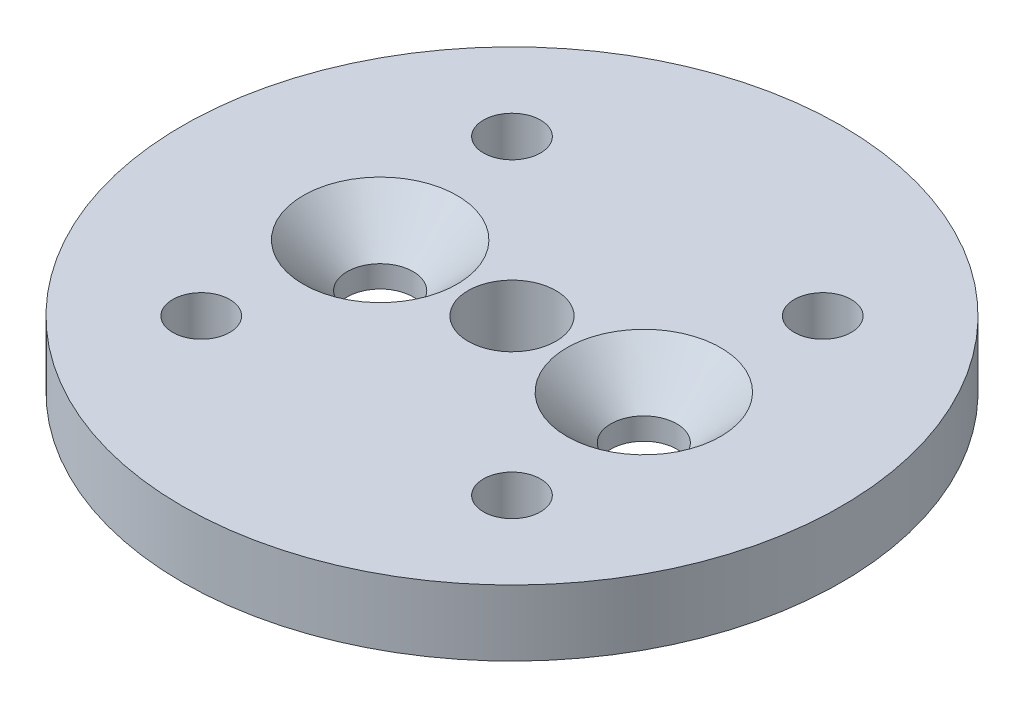
ISO-10303-21;
HEADER;
FILE_DESCRIPTION(('STEP AP214'),'2;1');
FILE_NAME('part.step','',(''),(''),'','','');
FILE_SCHEMA(('AUTOMOTIVE_DESIGN { 1 0 10303 214 1 1 1 1 }'));
ENDSEC;
DATA;
#1=APPLICATION_CONTEXT('core data for automotive mechanical design processes');
#2=APPLICATION_PROTOCOL_DEFINITION('international standard','automotive_design',2000,#1);
#3=PRODUCT_CONTEXT('',#1,'mechanical');
#4=PRODUCT('Part','Part','',(#3));
#5=PRODUCT_RELATED_PRODUCT_CATEGORY('part','',(#4));
#6=PRODUCT_DEFINITION_FORMATION('','',#4);
#7=PRODUCT_DEFINITION_CONTEXT('part definition',#1,'design');
#8=PRODUCT_DEFINITION('design','',#6,#7);
#9=PRODUCT_DEFINITION_SHAPE('','',#8);
#10=(LENGTH_UNIT() NAMED_UNIT(*) SI_UNIT(.MILLI.,.METRE.));
#11=(NAMED_UNIT(*) PLANE_ANGLE_UNIT() SI_UNIT($,.RADIAN.));
#12=(NAMED_UNIT(*) SI_UNIT($,.STERADIAN.) SOLID_ANGLE_UNIT());
#13=UNCERTAINTY_MEASURE_WITH_UNIT(LENGTH_MEASURE(1.E-05),#10,'distance_accuracy_value','');
#14=(GEOMETRIC_REPRESENTATION_CONTEXT(3) GLOBAL_UNCERTAINTY_ASSIGNED_CONTEXT((#13)) GLOBAL_UNIT_ASSIGNED_CONTEXT((#10,
#11,#12)) REPRESENTATION_CONTEXT('',''));
#15=CARTESIAN_POINT('',(0.,0.,0.));
#16=DIRECTION('',(0.,0.,1.));
#17=DIRECTION('',(1.,0.,0.));
#18=AXIS2_PLACEMENT_3D('',#15,#16,#17);
#19=CARTESIAN_POINT('',(0.,3.,0.));
#20=DIRECTION('',(0.,1.,0.));
#21=DIRECTION('',(0.,0.,1.));
#22=AXIS2_PLACEMENT_3D('',#19,#20,#21);
#23=PLANE('',#22);
#24=CARTESIAN_POINT('',(7.07213578500707,3.,-7.07213578500707));
#25=DIRECTION('',(0.,1.,0.));
#26=DIRECTION('',(0.,0.,1.));
#27=AXIS2_PLACEMENT_3D('',#24,#25,#26);
#28=CIRCLE('',#27,1.3);
#29=CARTESIAN_POINT('',(7.07213578500707,3.,-5.77213578500707));
#30=VERTEX_POINT('',#29);
#31=EDGE_CURVE('E88',#30,#30,#28,.T.);
#32=ORIENTED_EDGE('',*,*,#31,.F.);
#33=EDGE_LOOP('',(#32));
#34=FACE_BOUND('',#33,.T.);
#35=CARTESIAN_POINT('',(7.07213578500707,3.,7.07213578500707));
#36=DIRECTION('',(0.,1.,0.));
#37=DIRECTION('',(0.,0.,1.));
#38=AXIS2_PLACEMENT_3D('',#35,#36,#37);
#39=CIRCLE('',#38,1.3);
#40=CARTESIAN_POINT('',(7.07213578500707,3.,8.37213578500707));
#41=VERTEX_POINT('',#40);
#42=EDGE_CURVE('E82',#41,#41,#39,.T.);
#43=ORIENTED_EDGE('',*,*,#42,.F.);
#44=EDGE_LOOP('',(#43));
#45=FACE_BOUND('',#44,.T.);
#46=CARTESIAN_POINT('',(-7.07213578500707,3.,7.07213578500707));
#47=DIRECTION('',(0.,1.,0.));
#48=DIRECTION('',(0.,0.,1.));
#49=AXIS2_PLACEMENT_3D('',#46,#47,#48);
#50=CIRCLE('',#49,1.3);
#51=CARTESIAN_POINT('',(-7.07213578500707,3.,8.37213578500707));
#52=VERTEX_POINT('',#51);
#53=EDGE_CURVE('E76',#52,#52,#50,.T.);
#54=ORIENTED_EDGE('',*,*,#53,.F.);
#55=EDGE_LOOP('',(#54));
#56=FACE_BOUND('',#55,.T.);
#57=CARTESIAN_POINT('',(-7.07213578500707,3.,-7.07213578500707));
#58=DIRECTION('',(0.,1.,0.));
#59=DIRECTION('',(0.,0.,1.));
#60=AXIS2_PLACEMENT_3D('',#57,#58,#59);
#61=CIRCLE('',#60,1.3);
#62=CARTESIAN_POINT('',(-7.07213578500707,3.,-5.77213578500707));
#63=VERTEX_POINT('',#62);
#64=EDGE_CURVE('E70',#63,#63,#61,.T.);
#65=ORIENTED_EDGE('',*,*,#64,.F.);
#66=EDGE_LOOP('',(#65));
#67=FACE_BOUND('',#66,.T.);
#68=CARTESIAN_POINT('',(6.,3.,0.));
#69=DIRECTION('',(0.,1.,0.));
#70=DIRECTION('',(0.,0.,1.));
#71=AXIS2_PLACEMENT_3D('',#68,#69,#70);
#72=CIRCLE('',#71,3.50000000000001);
#73=CARTESIAN_POINT('',(6.,3.,3.50000000000001));
#74=VERTEX_POINT('',#73);
#75=EDGE_CURVE('E38',#74,#74,#72,.F.);
#76=ORIENTED_EDGE('',*,*,#75,.T.);
#77=EDGE_LOOP('',(#76));
#78=FACE_BOUND('',#77,.T.);
#79=CARTESIAN_POINT('',(-6.,3.,0.));
#80=DIRECTION('',(0.,1.,0.));
#81=DIRECTION('',(0.,0.,1.));
#82=AXIS2_PLACEMENT_3D('',#79,#80,#81);
#83=CIRCLE('',#82,3.50000000000001);
#84=CARTESIAN_POINT('',(-6.,3.,3.50000000000001));
#85=VERTEX_POINT('',#84);
#86=EDGE_CURVE('E42',#85,#85,#83,.F.);
#87=ORIENTED_EDGE('',*,*,#86,.T.);
#88=EDGE_LOOP('',(#87));
#89=FACE_BOUND('',#88,.T.);
#90=CARTESIAN_POINT('',(0.,3.,0.));
#91=DIRECTION('',(0.,1.,0.));
#92=DIRECTION('',(0.,0.,1.));
#93=AXIS2_PLACEMENT_3D('',#90,#91,#92);
#94=CIRCLE('',#93,15.);
#95=CARTESIAN_POINT('',(0.,3.,15.));
#96=VERTEX_POINT('',#95);
#97=EDGE_CURVE('E51',#96,#96,#94,.T.);
#98=ORIENTED_EDGE('',*,*,#97,.T.);
#99=EDGE_LOOP('',(#98));
#100=FACE_BOUND('',#99,.T.);
#101=CARTESIAN_POINT('',(0.,3.,0.));
#102=DIRECTION('',(0.,1.,0.));
#103=DIRECTION('',(0.,0.,1.));
#104=AXIS2_PLACEMENT_3D('',#101,#102,#103);
#105=CIRCLE('',#104,2.);
#106=CARTESIAN_POINT('',(0.,3.,2.));
#107=VERTEX_POINT('',#106);
#108=EDGE_CURVE('E55',#107,#107,#105,.T.);
#109=ORIENTED_EDGE('',*,*,#108,.F.);
#110=EDGE_LOOP('',(#109));
#111=FACE_BOUND('',#110,.T.);
#112=ADVANCED_FACE('F31',(#34,#45,#56,#67,#78,#89,#100,#111),#23,.T.);
#113=CARTESIAN_POINT('',(0.,0.,0.));
#114=DIRECTION('',(0.,1.,0.));
#115=DIRECTION('',(0.,0.,1.));
#116=AXIS2_PLACEMENT_3D('',#113,#114,#115);
#117=PLANE('',#116);
#118=CARTESIAN_POINT('',(7.07213578500707,0.,-7.07213578500707));
#119=DIRECTION('',(0.,1.,0.));
#120=DIRECTION('',(0.,0.,1.));
#121=AXIS2_PLACEMENT_3D('',#118,#119,#120);
#122=CIRCLE('',#121,1.3);
#123=CARTESIAN_POINT('',(7.07213578500707,0.,-5.77213578500707));
#124=VERTEX_POINT('',#123);
#125=EDGE_CURVE('E73',#124,#124,#122,.T.);
#126=ORIENTED_EDGE('',*,*,#125,.T.);
#127=EDGE_LOOP('',(#126));
#128=FACE_BOUND('',#127,.T.);
#129=CARTESIAN_POINT('',(7.07213578500707,0.,7.07213578500707));
#130=DIRECTION('',(0.,1.,0.));
#131=DIRECTION('',(0.,0.,1.));
#132=AXIS2_PLACEMENT_3D('',#129,#130,#131);
#133=CIRCLE('',#132,1.3);
#134=CARTESIAN_POINT('',(7.07213578500707,0.,8.37213578500707));
#135=VERTEX_POINT('',#134);
#136=EDGE_CURVE('E85',#135,#135,#133,.T.);
#137=ORIENTED_EDGE('',*,*,#136,.T.);
#138=EDGE_LOOP('',(#137));
#139=FACE_BOUND('',#138,.T.);
#140=CARTESIAN_POINT('',(-7.07213578500707,0.,7.07213578500707));
#141=DIRECTION('',(0.,1.,0.));
#142=DIRECTION('',(0.,0.,1.));
#143=AXIS2_PLACEMENT_3D('',#140,#141,#142);
#144=CIRCLE('',#143,1.3);
#145=CARTESIAN_POINT('',(-7.07213578500707,0.,8.37213578500707));
#146=VERTEX_POINT('',#145);
#147=EDGE_CURVE('E79',#146,#146,#144,.T.);
#148=ORIENTED_EDGE('',*,*,#147,.T.);
#149=EDGE_LOOP('',(#148));
#150=FACE_BOUND('',#149,.T.);
#151=CARTESIAN_POINT('',(-7.07213578500707,0.,-7.07213578500707));
#152=DIRECTION('',(0.,1.,0.));
#153=DIRECTION('',(0.,0.,1.));
#154=AXIS2_PLACEMENT_3D('',#151,#152,#153);
#155=CIRCLE('',#154,1.3);
#156=CARTESIAN_POINT('',(-7.07213578500707,0.,-5.77213578500707));
#157=VERTEX_POINT('',#156);
#158=EDGE_CURVE('E69',#157,#157,#155,.T.);
#159=ORIENTED_EDGE('',*,*,#158,.T.);
#160=EDGE_LOOP('',(#159));
#161=FACE_BOUND('',#160,.T.);
#162=CARTESIAN_POINT('',(-6.,0.,0.));
#163=DIRECTION('',(0.,1.,0.));
#164=DIRECTION('',(0.,0.,1.));
#165=AXIS2_PLACEMENT_3D('',#162,#163,#164);
#166=CIRCLE('',#165,1.5);
#167=CARTESIAN_POINT('',(-6.,0.,1.5));
#168=VERTEX_POINT('',#167);
#169=EDGE_CURVE('E66',#168,#168,#166,.T.);
#170=ORIENTED_EDGE('',*,*,#169,.T.);
#171=EDGE_LOOP('',(#170));
#172=FACE_BOUND('',#171,.T.);
#173=CARTESIAN_POINT('',(6.,0.,0.));
#174=DIRECTION('',(0.,1.,0.));
#175=DIRECTION('',(0.,0.,1.));
#176=AXIS2_PLACEMENT_3D('',#173,#174,#175);
#177=CIRCLE('',#176,1.5);
#178=CARTESIAN_POINT('',(6.,0.,1.5));
#179=VERTEX_POINT('',#178);
#180=EDGE_CURVE('E61',#179,#179,#177,.T.);
#181=ORIENTED_EDGE('',*,*,#180,.T.);
#182=EDGE_LOOP('',(#181));
#183=FACE_BOUND('',#182,.T.);
#184=CARTESIAN_POINT('',(0.,0.,0.));
#185=DIRECTION('',(0.,1.,0.));
#186=DIRECTION('',(0.,0.,1.));
#187=AXIS2_PLACEMENT_3D('',#184,#185,#186);
#188=CIRCLE('',#187,15.);
#189=CARTESIAN_POINT('',(0.,0.,15.));
#190=VERTEX_POINT('',#189);
#191=EDGE_CURVE('E52',#190,#190,#188,.T.);
#192=ORIENTED_EDGE('',*,*,#191,.F.);
#193=EDGE_LOOP('',(#192));
#194=FACE_BOUND('',#193,.T.);
#195=CARTESIAN_POINT('',(0.,0.,0.));
#196=DIRECTION('',(0.,1.,0.));
#197=DIRECTION('',(0.,0.,1.));
#198=AXIS2_PLACEMENT_3D('',#195,#196,#197);
#199=CIRCLE('',#198,2.);
#200=CARTESIAN_POINT('',(0.,0.,2.));
#201=VERTEX_POINT('',#200);
#202=EDGE_CURVE('E58',#201,#201,#199,.T.);
#203=ORIENTED_EDGE('',*,*,#202,.T.);
#204=EDGE_LOOP('',(#203));
#205=FACE_BOUND('',#204,.T.);
#206=ADVANCED_FACE('F94',(#128,#139,#150,#161,#172,#183,#194,#205),#117,.F.);
#207=CARTESIAN_POINT('',(0.,3.,0.));
#208=DIRECTION('',(0.,-1.,0.));
#209=DIRECTION('',(0.,0.,-1.));
#210=AXIS2_PLACEMENT_3D('',#207,#208,#209);
#211=CYLINDRICAL_SURFACE('',#210,15.);
#212=ORIENTED_EDGE('',*,*,#97,.F.);
#213=EDGE_LOOP('',(#212));
#214=FACE_BOUND('',#213,.T.);
#215=ORIENTED_EDGE('',*,*,#191,.T.);
#216=EDGE_LOOP('',(#215));
#217=FACE_BOUND('',#216,.T.);
#218=ADVANCED_FACE('F123',(#214,#217),#211,.T.);
#219=CARTESIAN_POINT('',(0.,3.,0.));
#220=DIRECTION('',(0.,-1.,0.));
#221=DIRECTION('',(0.,0.,-1.));
#222=AXIS2_PLACEMENT_3D('',#219,#220,#221);
#223=CYLINDRICAL_SURFACE('',#222,2.);
#224=ORIENTED_EDGE('',*,*,#108,.T.);
#225=EDGE_LOOP('',(#224));
#226=FACE_BOUND('',#225,.T.);
#227=ORIENTED_EDGE('',*,*,#202,.F.);
#228=EDGE_LOOP('',(#227));
#229=FACE_BOUND('',#228,.T.);
#230=ADVANCED_FACE('F119',(#226,#229),#223,.F.);
#231=CARTESIAN_POINT('',(6.,0.,0.));
#232=DIRECTION('',(0.,1.,0.));
#233=DIRECTION('',(0.,0.,1.));
#234=AXIS2_PLACEMENT_3D('',#231,#232,#233);
#235=CYLINDRICAL_SURFACE('',#234,1.5);
#236=CARTESIAN_POINT('',(6.,0.999999999999998,0.));
#237=DIRECTION('',(0.,1.,0.));
#238=DIRECTION('',(0.,0.,1.));
#239=AXIS2_PLACEMENT_3D('',#236,#237,#238);
#240=CIRCLE('',#239,1.5);
#241=CARTESIAN_POINT('',(6.,0.999999999999998,1.5));
#242=VERTEX_POINT('',#241);
#243=EDGE_CURVE('E46',#242,#242,#240,.T.);
#244=ORIENTED_EDGE('',*,*,#243,.T.);
#245=EDGE_LOOP('',(#244));
#246=FACE_BOUND('',#245,.T.);
#247=ORIENTED_EDGE('',*,*,#180,.F.);
#248=EDGE_LOOP('',(#247));
#249=FACE_BOUND('',#248,.T.);
#250=ADVANCED_FACE('F122',(#246,#249),#235,.F.);
#251=CARTESIAN_POINT('',(-6.,0.,0.));
#252=DIRECTION('',(0.,1.,0.));
#253=DIRECTION('',(0.,0.,1.));
#254=AXIS2_PLACEMENT_3D('',#251,#252,#253);
#255=CYLINDRICAL_SURFACE('',#254,1.5);
#256=CARTESIAN_POINT('',(-6.,0.999999999999998,0.));
#257=DIRECTION('',(0.,1.,0.));
#258=DIRECTION('',(0.,0.,1.));
#259=AXIS2_PLACEMENT_3D('',#256,#257,#258);
#260=CIRCLE('',#259,1.5);
#261=CARTESIAN_POINT('',(-6.,0.999999999999998,1.5));
#262=VERTEX_POINT('',#261);
#263=EDGE_CURVE('E10',#262,#262,#260,.T.);
#264=ORIENTED_EDGE('',*,*,#263,.T.);
#265=EDGE_LOOP('',(#264));
#266=FACE_BOUND('',#265,.T.);
#267=ORIENTED_EDGE('',*,*,#169,.F.);
#268=EDGE_LOOP('',(#267));
#269=FACE_BOUND('',#268,.T.);
#270=ADVANCED_FACE('F136',(#266,#269),#255,.F.);
#271=CARTESIAN_POINT('',(6.,0.999999999999998,0.));
#272=DIRECTION('',(0.,1.,0.));
#273=DIRECTION('',(0.,0.,1.));
#274=AXIS2_PLACEMENT_3D('',#271,#272,#273);
#275=CONICAL_SURFACE('',#274,1.5,0.78539816339745);
#276=ORIENTED_EDGE('',*,*,#75,.F.);
#277=EDGE_LOOP('',(#276));
#278=FACE_BOUND('',#277,.T.);
#279=ORIENTED_EDGE('',*,*,#243,.F.);
#280=EDGE_LOOP('',(#279));
#281=FACE_BOUND('',#280,.T.);
#282=ADVANCED_FACE('F134',(#278,#281),#275,.F.);
#283=CARTESIAN_POINT('',(-6.,0.999999999999998,0.));
#284=DIRECTION('',(0.,1.,0.));
#285=DIRECTION('',(0.,0.,1.));
#286=AXIS2_PLACEMENT_3D('',#283,#284,#285);
#287=CONICAL_SURFACE('',#286,1.5,0.78539816339745);
#288=ORIENTED_EDGE('',*,*,#86,.F.);
#289=EDGE_LOOP('',(#288));
#290=FACE_BOUND('',#289,.T.);
#291=ORIENTED_EDGE('',*,*,#263,.F.);
#292=EDGE_LOOP('',(#291));
#293=FACE_BOUND('',#292,.T.);
#294=ADVANCED_FACE('F33',(#290,#293),#287,.F.);
#295=CARTESIAN_POINT('',(-7.07213578500707,0.,-7.07213578500707));
#296=DIRECTION('',(0.,1.,0.));
#297=DIRECTION('',(0.,0.,1.));
#298=AXIS2_PLACEMENT_3D('',#295,#296,#297);
#299=CYLINDRICAL_SURFACE('',#298,1.3);
#300=ORIENTED_EDGE('',*,*,#158,.F.);
#301=EDGE_LOOP('',(#300));
#302=FACE_BOUND('',#301,.T.);
#303=ORIENTED_EDGE('',*,*,#64,.T.);
#304=EDGE_LOOP('',(#303));
#305=FACE_BOUND('',#304,.T.);
#306=ADVANCED_FACE('F142',(#302,#305),#299,.F.);
#307=CARTESIAN_POINT('',(-7.07213578500707,0.,7.07213578500707));
#308=DIRECTION('',(0.,1.,0.));
#309=DIRECTION('',(0.,0.,1.));
#310=AXIS2_PLACEMENT_3D('',#307,#308,#309);
#311=CYLINDRICAL_SURFACE('',#310,1.3);
#312=ORIENTED_EDGE('',*,*,#147,.F.);
#313=EDGE_LOOP('',(#312));
#314=FACE_BOUND('',#313,.T.);
#315=ORIENTED_EDGE('',*,*,#53,.T.);
#316=EDGE_LOOP('',(#315));
#317=FACE_BOUND('',#316,.T.);
#318=ADVANCED_FACE('F161',(#314,#317),#311,.F.);
#319=CARTESIAN_POINT('',(7.07213578500707,0.,7.07213578500707));
#320=DIRECTION('',(0.,1.,0.));
#321=DIRECTION('',(0.,0.,1.));
#322=AXIS2_PLACEMENT_3D('',#319,#320,#321);
#323=CYLINDRICAL_SURFACE('',#322,1.3);
#324=ORIENTED_EDGE('',*,*,#136,.F.);
#325=EDGE_LOOP('',(#324));
#326=FACE_BOUND('',#325,.T.);
#327=ORIENTED_EDGE('',*,*,#42,.T.);
#328=EDGE_LOOP('',(#327));
#329=FACE_BOUND('',#328,.T.);
#330=ADVANCED_FACE('F100',(#326,#329),#323,.F.);
#331=CARTESIAN_POINT('',(7.07213578500707,0.,-7.07213578500707));
#332=DIRECTION('',(0.,1.,0.));
#333=DIRECTION('',(0.,0.,1.));
#334=AXIS2_PLACEMENT_3D('',#331,#332,#333);
#335=CYLINDRICAL_SURFACE('',#334,1.3);
#336=ORIENTED_EDGE('',*,*,#125,.F.);
#337=EDGE_LOOP('',(#336));
#338=FACE_BOUND('',#337,.T.);
#339=ORIENTED_EDGE('',*,*,#31,.T.);
#340=EDGE_LOOP('',(#339));
#341=FACE_BOUND('',#340,.T.);
#342=ADVANCED_FACE('F97',(#338,#341),#335,.F.);
#343=CLOSED_SHELL('',(#112,#206,#218,#230,#250,#270,#282,#294,#306,#318,#330,#342));
#344=MANIFOLD_SOLID_BREP('B2',#343);
#345=ADVANCED_BREP_SHAPE_REPRESENTATION('',(#18,#344),#14);
#346=SHAPE_DEFINITION_REPRESENTATION(#9,#345);
ENDSEC;
END-ISO-10303-21;
